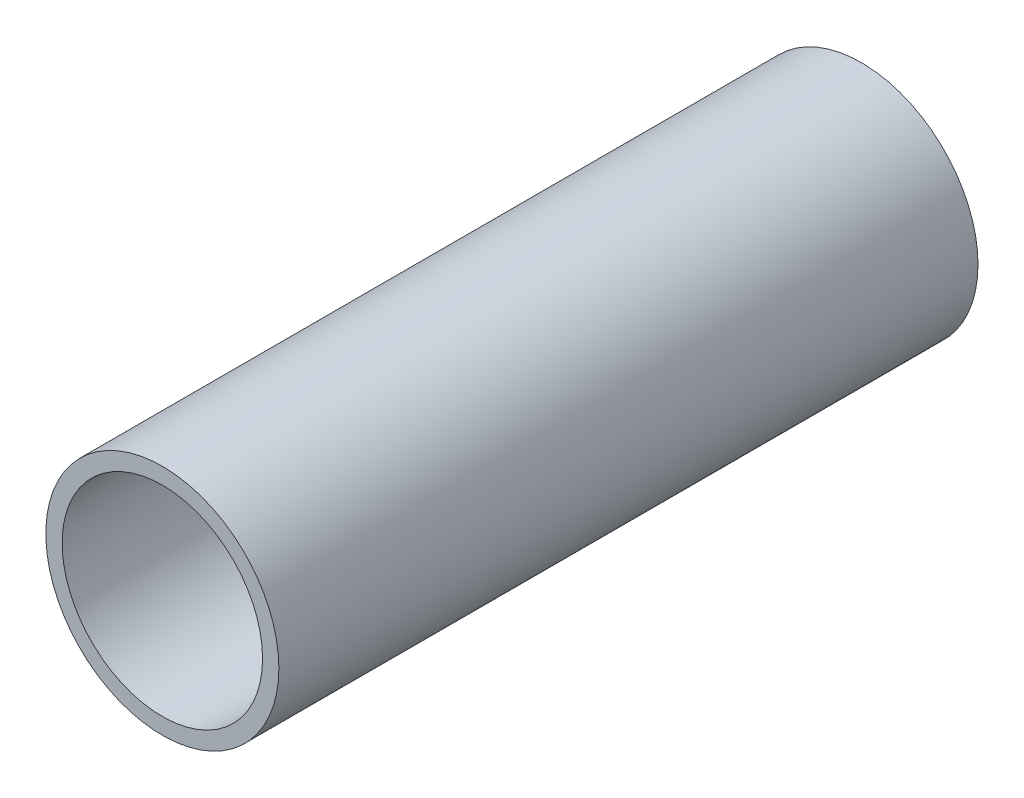
ISO-10303-21;
HEADER;
FILE_DESCRIPTION(('STEP AP214'),'2;1');
FILE_NAME('part.step','',(''),(''),'','','');
FILE_SCHEMA(('AUTOMOTIVE_DESIGN { 1 0 10303 214 1 1 1 1 }'));
ENDSEC;
DATA;
#1=APPLICATION_CONTEXT('core data for automotive mechanical design processes');
#2=APPLICATION_PROTOCOL_DEFINITION('international standard','automotive_design',2000,#1);
#3=PRODUCT_CONTEXT('',#1,'mechanical');
#4=PRODUCT('Part','Part','',(#3));
#5=PRODUCT_RELATED_PRODUCT_CATEGORY('part','',(#4));
#6=PRODUCT_DEFINITION_FORMATION('','',#4);
#7=PRODUCT_DEFINITION_CONTEXT('part definition',#1,'design');
#8=PRODUCT_DEFINITION('design','',#6,#7);
#9=PRODUCT_DEFINITION_SHAPE('','',#8);
#10=(LENGTH_UNIT() NAMED_UNIT(*) SI_UNIT(.MILLI.,.METRE.));
#11=(NAMED_UNIT(*) PLANE_ANGLE_UNIT() SI_UNIT($,.RADIAN.));
#12=(NAMED_UNIT(*) SI_UNIT($,.STERADIAN.) SOLID_ANGLE_UNIT());
#13=UNCERTAINTY_MEASURE_WITH_UNIT(LENGTH_MEASURE(1.E-05),#10,'distance_accuracy_value','');
#14=(GEOMETRIC_REPRESENTATION_CONTEXT(3) GLOBAL_UNCERTAINTY_ASSIGNED_CONTEXT((#13)) GLOBAL_UNIT_ASSIGNED_CONTEXT((#10,
#11,#12)) REPRESENTATION_CONTEXT('',''));
#15=CARTESIAN_POINT('',(0.,0.,0.));
#16=DIRECTION('',(0.,0.,1.));
#17=DIRECTION('',(1.,0.,0.));
#18=AXIS2_PLACEMENT_3D('',#15,#16,#17);
#19=CARTESIAN_POINT('',(0.,0.,38.1));
#20=DIRECTION('',(0.,0.,-1.));
#21=DIRECTION('',(-1.,0.,0.));
#22=AXIS2_PLACEMENT_3D('',#19,#20,#21);
#23=CYLINDRICAL_SURFACE('',#22,5.461);
#24=CARTESIAN_POINT('',(0.,-5.461,30.575));
#25=CARTESIAN_POINT('',(0.108491179154578,-5.46100223938956,30.5750030443358));
#26=CARTESIAN_POINT('',(0.216961048635089,-5.45773846887579,30.5661443732503));
#27=CARTESIAN_POINT('',(0.430668975561198,-5.44504371516819,30.5310793792461));
#28=CARTESIAN_POINT('',(0.535907330231654,-5.43561330095301,30.5048746567954));
#29=CARTESIAN_POINT('',(0.74003991624861,-5.41160028639268,30.4361619612842));
#30=CARTESIAN_POINT('',(0.838945632205151,-5.39702734411741,30.3936845369159));
#31=CARTESIAN_POINT('',(1.0282227072047,-5.36418849796975,30.2937838227913));
#32=CARTESIAN_POINT('',(1.11859188586085,-5.34592165432953,30.2363567286094));
#33=CARTESIAN_POINT('',(1.29191688691412,-5.30675604706477,30.1057370732668));
#34=CARTESIAN_POINT('',(1.37447791222339,-5.28578520274446,30.032042437963));
#35=CARTESIAN_POINT('',(1.5263838335753,-5.24393868438475,29.8720456387839));
#36=CARTESIAN_POINT('',(1.59572495122447,-5.22306303921336,29.7857398829259));
#37=CARTESIAN_POINT('',(1.72167571511299,-5.18294210411501,29.599180298446));
#38=CARTESIAN_POINT('',(1.77773750600785,-5.1637825010515,29.4985363414913));
#39=CARTESIAN_POINT('',(1.87196440094197,-5.13037895056659,29.2884352526025));
#40=CARTESIAN_POINT('',(1.91013627781836,-5.11613314340031,29.1789814743452));
#41=CARTESIAN_POINT('',(1.96595796341741,-5.09493820673969,28.9589023819991));
#42=CARTESIAN_POINT('',(1.98435850463217,-5.08772320236641,28.8484939329444));
#43=CARTESIAN_POINT('',(2.00246270555631,-5.08062674394286,28.6259388739682));
#44=CARTESIAN_POINT('',(2.00217363581966,-5.08074243813467,28.5137929569229));
#45=CARTESIAN_POINT('',(1.98348277458646,-5.08806422998194,28.2977077819827));
#46=CARTESIAN_POINT('',(1.96610816220022,-5.09486822011214,28.193663559153));
#47=CARTESIAN_POINT('',(1.91543258945748,-5.11413395542866,27.9900852341723));
#48=CARTESIAN_POINT('',(1.8821293426403,-5.12659651285562,27.8905517817617));
#49=CARTESIAN_POINT('',(1.7999547806136,-5.15602672826673,27.6966749352573));
#50=CARTESIAN_POINT('',(1.7508089263731,-5.17307288069246,27.6024603425425));
#51=CARTESIAN_POINT('',(1.638535328542,-5.20972199916762,27.4233114383435));
#52=CARTESIAN_POINT('',(1.57540291845724,-5.22932581766085,27.3383802383404));
#53=CARTESIAN_POINT('',(1.4321978565155,-5.27040948459133,27.1745034404436));
#54=CARTESIAN_POINT('',(1.35130081109236,-5.29192918644096,27.0962865357804));
#55=CARTESIAN_POINT('',(1.17728570725163,-5.33333947918591,26.9543183265342));
#56=CARTESIAN_POINT('',(1.08416594307532,-5.35322984206612,26.8905690443958));
#57=CARTESIAN_POINT('',(0.886559296206195,-5.38950386987367,26.778591347858));
#58=CARTESIAN_POINT('',(0.781930304371776,-5.40583397489143,26.7305951374218));
#59=CARTESIAN_POINT('',(0.565337186046532,-5.4327523874302,26.6531241613201));
#60=CARTESIAN_POINT('',(0.453376182832028,-5.44334312219322,26.6236415652072));
#61=CARTESIAN_POINT('',(0.231438010025861,-5.45716819459852,26.5854113358455));
#62=CARTESIAN_POINT('',(0.121651496236989,-5.46075057449371,26.5756817385615));
#63=CARTESIAN_POINT('',(-0.0980306351952367,-5.46122388338287,26.5743880048742));
#64=CARTESIAN_POINT('',(-0.207926225135362,-5.45811621526078,26.5828200600244));
#65=CARTESIAN_POINT('',(-0.420532609487839,-5.44578848874136,26.6168565685657));
#66=CARTESIAN_POINT('',(-0.523359409426412,-5.43679435894001,26.6418266824631));
#67=CARTESIAN_POINT('',(-0.723298895769758,-5.41382438256404,26.7074045701217));
#68=CARTESIAN_POINT('',(-0.820410836833405,-5.39984788785158,26.7480143784493));
#69=CARTESIAN_POINT('',(-1.00929827466281,-5.36780071334321,26.844996189869));
#70=CARTESIAN_POINT('',(-1.10083913633824,-5.34962359428052,26.901788948068));
#71=CARTESIAN_POINT('',(-1.27339154965867,-5.31119779335956,27.0290452196877));
#72=CARTESIAN_POINT('',(-1.35439932867276,-5.29094837388133,27.0995136089035));
#73=CARTESIAN_POINT('',(-1.50826525829655,-5.24922498579124,27.2567100740174));
#74=CARTESIAN_POINT('',(-1.58042534033367,-5.2277452042933,27.3441216461276));
#75=CARTESIAN_POINT('',(-1.70917944910057,-5.18708001418718,27.5302465011366));
#76=CARTESIAN_POINT('',(-1.76577241023928,-5.16789476269355,27.6289605570514));
#77=CARTESIAN_POINT('',(-1.86175863758426,-5.13410031540785,27.8355073177876));
#78=CARTESIAN_POINT('',(-1.90110769778134,-5.11950290764174,27.9433626228273));
#79=CARTESIAN_POINT('',(-1.96084433341598,-5.09692555269108,28.1648473177861));
#80=CARTESIAN_POINT('',(-1.98124290720843,-5.08894176742893,28.2784733181089));
#81=CARTESIAN_POINT('',(-2.00154177740892,-5.08098995122837,28.5007497087811));
#82=CARTESIAN_POINT('',(-2.00262533523918,-5.08055923805152,28.6092764523232));
#83=CARTESIAN_POINT('',(-1.98726894814168,-5.08658527787233,28.8248777450848));
#84=CARTESIAN_POINT('',(-1.97083051117601,-5.09304143817814,28.9319524184679));
#85=CARTESIAN_POINT('',(-1.92180124615361,-5.11173702032731,29.1386052574135));
#86=CARTESIAN_POINT('',(-1.88967130752248,-5.12381098431463,29.2383089970548));
#87=CARTESIAN_POINT('',(-1.81056913492781,-5.15229258994758,29.4309739493755));
#88=CARTESIAN_POINT('',(-1.7635932346924,-5.16870130191279,29.5239334895669));
#89=CARTESIAN_POINT('',(-1.65336920167476,-5.20503760461863,29.7055845457592));
#90=CARTESIAN_POINT('',(-1.58941765168616,-5.22510128962595,29.793821712823));
#91=CARTESIAN_POINT('',(-1.44816795133776,-5.26599768525611,29.9586912474642));
#92=CARTESIAN_POINT('',(-1.37086566048682,-5.28683063287132,30.0353200010211));
#93=CARTESIAN_POINT('',(-1.20042483162023,-5.32818545097307,30.178745068204));
#94=CARTESIAN_POINT('',(-1.1066825755437,-5.34863814271819,30.2448469480443));
#95=CARTESIAN_POINT('',(-0.908707931475497,-5.38580572290981,30.3603232509934));
#96=CARTESIAN_POINT('',(-0.804475539815672,-5.40252061004928,30.4096976682529));
#97=CARTESIAN_POINT('',(-0.585788005534008,-5.43063484324844,30.4909255295511));
#98=CARTESIAN_POINT('',(-0.471148400865916,-5.44189797665209,30.5223332433169));
#99=CARTESIAN_POINT('',(-0.237662750728607,-5.45707769895462,30.564364200503));
#100=CARTESIAN_POINT('',(-0.118818595484139,-5.46099754744003,30.57499666587));
#101=CARTESIAN_POINT('',(0.,-5.461,30.575));
#102=B_SPLINE_CURVE_WITH_KNOTS('',3,(#24,#25,#26,#27,#28,#29,#30,#31,#32,#33,#34,#35,#36,#37,
#38,#39,#40,#41,#42,#43,#44,#45,#46,#47,#48,#49,#50,#51,#52,#53,#54,#55,#56,#57,#58,#59,#60,#61,
#62,#63,#64,#65,#66,#67,#68,#69,#70,#71,#72,#73,#74,#75,#76,#77,#78,#79,#80,#81,#82,#83,#84,#85,
#86,#87,#88,#89,#90,#91,#92,#93,#94,#95,#96,#97,#98,#99,#100,#101),.UNSPECIFIED.,.T.,.F.,(4,2,2,
2,2,2,2,2,2,2,2,2,2,2,2,2,2,2,2,2,2,2,2,2,2,2,2,2,2,2,2,2,2,2,2,2,2,2,4),(0.,0.325035485459794,
0.650040985051903,0.974439319269884,1.2989202879437,1.63533301902956,1.97184175686376,
2.32045828299172,2.66894272161796,3.00366862406861,3.3382643136382,3.6539021013308,
3.96958521055328,4.29106284169025,4.61264789303976,4.95477117656569,5.29694225645355,
5.64395149492557,5.99081386466917,6.31996345341913,6.64904402716554,6.96618137042539,
7.28335998399854,7.60968485742597,7.93612629044886,8.28061354314366,8.62512437060534,
8.97051328287646,9.31570161521287,9.63966528093859,9.96360106824688,10.2785476004609,
10.5935719708855,10.9245452578261,11.2556213750811,11.6034634036284,11.951305553808,
12.3074397102256,12.6634157459346),.UNSPECIFIED.);
#103=CARTESIAN_POINT('',(0.,-5.461,30.575));
#104=VERTEX_POINT('',#103);
#105=EDGE_CURVE('E68',#104,#104,#102,.T.);
#106=ORIENTED_EDGE('',*,*,#105,.F.);
#107=EDGE_LOOP('',(#106));
#108=FACE_BOUND('',#107,.T.);
#109=CARTESIAN_POINT('',(0.,-5.461,11.525));
#110=CARTESIAN_POINT('',(0.108491179154579,-5.46100223938956,11.5250030443358));
#111=CARTESIAN_POINT('',(0.21696104863509,-5.45773846887579,11.5161443732503));
#112=CARTESIAN_POINT('',(0.430668975561199,-5.44504371516819,11.4810793792461));
#113=CARTESIAN_POINT('',(0.535907330231654,-5.43561330095301,11.4548746567954));
#114=CARTESIAN_POINT('',(0.740039916248611,-5.41160028639268,11.3861619612842));
#115=CARTESIAN_POINT('',(0.838945632205152,-5.39702734411741,11.3436845369159));
#116=CARTESIAN_POINT('',(1.0282227072047,-5.36418849796975,11.2437838227913));
#117=CARTESIAN_POINT('',(1.11859188586085,-5.34592165432953,11.1863567286094));
#118=CARTESIAN_POINT('',(1.29191688691412,-5.30675604706476,11.0557370732668));
#119=CARTESIAN_POINT('',(1.37447791222339,-5.28578520274446,10.982042437963));
#120=CARTESIAN_POINT('',(1.5263838335753,-5.24393868438475,10.8220456387839));
#121=CARTESIAN_POINT('',(1.59572495122447,-5.22306303921336,10.7357398829259));
#122=CARTESIAN_POINT('',(1.72167571511299,-5.18294210411501,10.549180298446));
#123=CARTESIAN_POINT('',(1.77773750600785,-5.1637825010515,10.4485363414913));
#124=CARTESIAN_POINT('',(1.87196440094197,-5.13037895056659,10.2384352526025));
#125=CARTESIAN_POINT('',(1.91013627781836,-5.11613314340031,10.1289814743452));
#126=CARTESIAN_POINT('',(1.96595796341741,-5.09493820673969,9.9089023819991));
#127=CARTESIAN_POINT('',(1.98435850463217,-5.08772320236641,9.7984939329444));
#128=CARTESIAN_POINT('',(2.00246270555631,-5.08062674394286,9.57593887396818));
#129=CARTESIAN_POINT('',(2.00217363581966,-5.08074243813467,9.4637929569229));
#130=CARTESIAN_POINT('',(1.98348277458646,-5.08806422998194,9.24770778198275));
#131=CARTESIAN_POINT('',(1.96610816220023,-5.09486822011214,9.14366355915301));
#132=CARTESIAN_POINT('',(1.91543258945748,-5.11413395542866,8.94008523417226));
#133=CARTESIAN_POINT('',(1.8821293426403,-5.12659651285562,8.84055178176172));
#134=CARTESIAN_POINT('',(1.7999547806136,-5.15602672826673,8.64667493525727));
#135=CARTESIAN_POINT('',(1.7508089263731,-5.17307288069246,8.55246034254245));
#136=CARTESIAN_POINT('',(1.638535328542,-5.20972199916762,8.37331143834355));
#137=CARTESIAN_POINT('',(1.57540291845724,-5.22932581766085,8.28838023834038));
#138=CARTESIAN_POINT('',(1.4321978565155,-5.27040948459133,8.12450344044362));
#139=CARTESIAN_POINT('',(1.35130081109235,-5.29192918644096,8.04628653578038));
#140=CARTESIAN_POINT('',(1.17728570725163,-5.33333947918591,7.90431832653424));
#141=CARTESIAN_POINT('',(1.08416594307532,-5.35322984206612,7.8405690443958));
#142=CARTESIAN_POINT('',(0.886559296206197,-5.38950386987367,7.728591347858));
#143=CARTESIAN_POINT('',(0.781930304371777,-5.40583397489143,7.68059513742183));
#144=CARTESIAN_POINT('',(0.565337186046533,-5.4327523874302,7.60312416132009));
#145=CARTESIAN_POINT('',(0.453376182832029,-5.44334312219322,7.57364156520723));
#146=CARTESIAN_POINT('',(0.231438010025862,-5.45716819459852,7.53541133584546));
#147=CARTESIAN_POINT('',(0.12165149623699,-5.46075057449371,7.52568173856152));
#148=CARTESIAN_POINT('',(-0.0980306351952351,-5.46122388338287,7.52438800487416));
#149=CARTESIAN_POINT('',(-0.207926225135361,-5.45811621526078,7.53282006002439));
#150=CARTESIAN_POINT('',(-0.420532609487837,-5.44578848874136,7.56685656856565));
#151=CARTESIAN_POINT('',(-0.52335940942641,-5.43679435894001,7.59182668246314));
#152=CARTESIAN_POINT('',(-0.723298895769756,-5.41382438256404,7.6574045701217));
#153=CARTESIAN_POINT('',(-0.820410836833404,-5.39984788785158,7.69801437844927));
#154=CARTESIAN_POINT('',(-1.00929827466281,-5.36780071334321,7.79499618986903));
#155=CARTESIAN_POINT('',(-1.10083913633824,-5.34962359428052,7.85178894806802));
#156=CARTESIAN_POINT('',(-1.27339154965867,-5.31119779335956,7.97904521968775));
#157=CARTESIAN_POINT('',(-1.35439932867276,-5.29094837388134,8.04951360890352));
#158=CARTESIAN_POINT('',(-1.50826525829655,-5.24922498579124,8.20671007401743));
#159=CARTESIAN_POINT('',(-1.58042534033367,-5.2277452042933,8.29412164612759));
#160=CARTESIAN_POINT('',(-1.70917944910057,-5.18708001418718,8.48024650113656));
#161=CARTESIAN_POINT('',(-1.76577241023928,-5.16789476269355,8.57896055705142));
#162=CARTESIAN_POINT('',(-1.86175863758426,-5.13410031540785,8.78550731778756));
#163=CARTESIAN_POINT('',(-1.90110769778134,-5.11950290764174,8.89336262282728));
#164=CARTESIAN_POINT('',(-1.96084433341598,-5.09692555269108,9.11484731778612));
#165=CARTESIAN_POINT('',(-1.98124290720843,-5.08894176742893,9.22847331810889));
#166=CARTESIAN_POINT('',(-2.00154177740892,-5.08098995122837,9.45074970878109));
#167=CARTESIAN_POINT('',(-2.00262533523918,-5.08055923805152,9.5592764523232));
#168=CARTESIAN_POINT('',(-1.98726894814168,-5.08658527787233,9.77487774508479));
#169=CARTESIAN_POINT('',(-1.97083051117601,-5.09304143817814,9.88195241846794));
#170=CARTESIAN_POINT('',(-1.92180124615361,-5.11173702032731,10.0886052574135));
#171=CARTESIAN_POINT('',(-1.88967130752248,-5.12381098431463,10.1883089970548));
#172=CARTESIAN_POINT('',(-1.8105691349278,-5.15229258994758,10.3809739493755));
#173=CARTESIAN_POINT('',(-1.76359323469239,-5.16870130191279,10.4739334895669));
#174=CARTESIAN_POINT('',(-1.65336920167476,-5.20503760461863,10.6555845457592));
#175=CARTESIAN_POINT('',(-1.58941765168616,-5.22510128962595,10.743821712823));
#176=CARTESIAN_POINT('',(-1.44816795133775,-5.26599768525612,10.9086912474642));
#177=CARTESIAN_POINT('',(-1.37086566048682,-5.28683063287132,10.9853200010211));
#178=CARTESIAN_POINT('',(-1.20042483162023,-5.32818545097307,11.128745068204));
#179=CARTESIAN_POINT('',(-1.1066825755437,-5.34863814271819,11.1948469480443));
#180=CARTESIAN_POINT('',(-0.908707931475494,-5.38580572290981,11.3103232509934));
#181=CARTESIAN_POINT('',(-0.804475539815669,-5.40252061004928,11.3596976682529));
#182=CARTESIAN_POINT('',(-0.585788005534006,-5.43063484324845,11.4409255295511));
#183=CARTESIAN_POINT('',(-0.471148400865914,-5.44189797665209,11.4723332433169));
#184=CARTESIAN_POINT('',(-0.237662750728605,-5.45707769895462,11.514364200503));
#185=CARTESIAN_POINT('',(-0.118818595484137,-5.46099754744003,11.52499666587));
#186=CARTESIAN_POINT('',(0.,-5.461,11.525));
#187=B_SPLINE_CURVE_WITH_KNOTS('',3,(#109,#110,#111,#112,#113,#114,#115,#116,#117,#118,#119,
#120,#121,#122,#123,#124,#125,#126,#127,#128,#129,#130,#131,#132,#133,#134,#135,#136,#137,#138,
#139,#140,#141,#142,#143,#144,#145,#146,#147,#148,#149,#150,#151,#152,#153,#154,#155,#156,#157,
#158,#159,#160,#161,#162,#163,#164,#165,#166,#167,#168,#169,#170,#171,#172,#173,#174,#175,#176,
#177,#178,#179,#180,#181,#182,#183,#184,#185,#186),.UNSPECIFIED.,.T.,.F.,(4,2,2,2,2,2,2,2,2,2,2,
2,2,2,2,2,2,2,2,2,2,2,2,2,2,2,2,2,2,2,2,2,2,2,2,2,2,2,4),(0.,0.325035485459794,
0.650040985051903,0.974439319269884,1.2989202879437,1.63533301902956,1.97184175686376,
2.32045828299172,2.66894272161796,3.00366862406862,3.3382643136382,3.6539021013308,
3.96958521055327,4.29106284169025,4.61264789303976,4.95477117656569,5.29694225645355,
5.64395149492557,5.99081386466917,6.31996345341912,6.64904402716554,6.96618137042539,
7.28335998399854,7.60968485742597,7.93612629044886,8.28061354314366,8.62512437060534,
8.97051328287646,9.31570161521287,9.63966528093859,9.96360106824688,10.2785476004609,
10.5935719708855,10.9245452578261,11.2556213750811,11.6034634036284,11.951305553808,
12.3074397102256,12.6634157459346),.UNSPECIFIED.);
#188=CARTESIAN_POINT('',(0.,-5.461,11.525));
#189=VERTEX_POINT('',#188);
#190=EDGE_CURVE('E60',#189,#189,#187,.T.);
#191=ORIENTED_EDGE('',*,*,#190,.F.);
#192=EDGE_LOOP('',(#191));
#193=FACE_BOUND('',#192,.T.);
#194=CARTESIAN_POINT('',(0.,0.,38.1));
#195=DIRECTION('',(0.,0.,1.));
#196=DIRECTION('',(1.,0.,0.));
#197=AXIS2_PLACEMENT_3D('',#194,#195,#196);
#198=CIRCLE('',#197,5.461);
#199=CARTESIAN_POINT('',(5.461,0.,38.1));
#200=VERTEX_POINT('',#199);
#201=EDGE_CURVE('E48',#200,#200,#198,.T.);
#202=ORIENTED_EDGE('',*,*,#201,.T.);
#203=EDGE_LOOP('',(#202));
#204=FACE_BOUND('',#203,.T.);
#205=CARTESIAN_POINT('',(0.,0.,0.));
#206=DIRECTION('',(0.,0.,1.));
#207=DIRECTION('',(1.,0.,0.));
#208=AXIS2_PLACEMENT_3D('',#205,#206,#207);
#209=CIRCLE('',#208,5.461);
#210=CARTESIAN_POINT('',(5.461,0.,0.));
#211=VERTEX_POINT('',#210);
#212=EDGE_CURVE('E57',#211,#211,#209,.T.);
#213=ORIENTED_EDGE('',*,*,#212,.F.);
#214=EDGE_LOOP('',(#213));
#215=FACE_BOUND('',#214,.T.);
#216=ADVANCED_FACE('F36',(#108,#193,#204,#215),#23,.F.);
#217=CARTESIAN_POINT('',(0.,0.,38.1));
#218=DIRECTION('',(0.,0.,-1.));
#219=DIRECTION('',(-1.,0.,0.));
#220=AXIS2_PLACEMENT_3D('',#217,#218,#219);
#221=CYLINDRICAL_SURFACE('',#220,6.35);
#222=CARTESIAN_POINT('',(0.,-6.35,30.575));
#223=CARTESIAN_POINT('',(0.109459382542907,-6.34999954177387,30.5749994164505));
#224=CARTESIAN_POINT('',(0.218925049959982,-6.34714311321166,30.5659844128984));
#225=CARTESIAN_POINT('',(0.434652473788956,-6.33602827356407,30.5302589175087));
#226=CARTESIAN_POINT('',(0.540913545874182,-6.32776871709148,30.5035446736654));
#227=CARTESIAN_POINT('',(0.747089875657803,-6.30674936557198,30.433412839271));
#228=CARTESIAN_POINT('',(0.847014764673544,-6.2939966038065,30.3900213442808));
#229=CARTESIAN_POINT('',(1.03817017833074,-6.26530583445687,30.287878559723));
#230=CARTESIAN_POINT('',(1.12939928812193,-6.24936730983396,30.2291247764294));
#231=CARTESIAN_POINT('',(1.30343118018697,-6.21543683798116,30.0959886387944));
#232=CARTESIAN_POINT('',(1.38592345094522,-6.19739963027479,30.0212119736439));
#233=CARTESIAN_POINT('',(1.53742831833673,-6.16156531174633,29.858992127567));
#234=CARTESIAN_POINT('',(1.60643835501439,-6.14376824711775,29.7715465465938));
#235=CARTESIAN_POINT('',(1.73071363408787,-6.10994220236163,29.5837707062383));
#236=CARTESIAN_POINT('',(1.78558916761595,-6.09396900491067,29.4831715227718));
#237=CARTESIAN_POINT('',(1.87751386092633,-6.06628083683232,29.273588013396));
#238=CARTESIAN_POINT('',(1.91456780104787,-6.05456472452069,29.1646059451607));
#239=CARTESIAN_POINT('',(1.96865797245166,-6.03719105635796,28.9448574324552));
#240=CARTESIAN_POINT('',(1.98627089440143,-6.03135942687503,28.8342470865849));
#241=CARTESIAN_POINT('',(2.00278087222624,-6.02589838737814,28.611499438398));
#242=CARTESIAN_POINT('',(2.00168299423813,-6.02626729850521,28.4993625576223));
#243=CARTESIAN_POINT('',(1.98125320609646,-6.03301213155008,28.281532037457));
#244=CARTESIAN_POINT('',(1.96265658538293,-6.03914580837347,28.1757606687388));
#245=CARTESIAN_POINT('',(1.90895021373769,-6.05633519979143,27.9689230657145));
#246=CARTESIAN_POINT('',(1.8738386824976,-6.06739144503234,27.8678573399681));
#247=CARTESIAN_POINT('',(1.78758434079555,-6.0933643515369,27.6715576691876));
#248=CARTESIAN_POINT('',(1.73621215869283,-6.10833567795451,27.5764320539873));
#249=CARTESIAN_POINT('',(1.6190540664784,-6.14042705773518,27.3959112784986));
#250=CARTESIAN_POINT('',(1.55326436261561,-6.15754767614423,27.3105186883145));
#251=CARTESIAN_POINT('',(1.40553948054554,-6.19297824394465,27.1477338767739));
#252=CARTESIAN_POINT('',(1.32299795804768,-6.2113065642987,27.0708948770763));
#253=CARTESIAN_POINT('',(1.14597287727255,-6.24638917019528,26.9320139239921));
#254=CARTESIAN_POINT('',(1.05148840693984,-6.26314333535266,26.8699731017542));
#255=CARTESIAN_POINT('',(0.852181054275976,-6.29337063173254,26.7620667906204));
#256=CARTESIAN_POINT('',(0.747281283701516,-6.30681635072294,26.7163351185409));
#257=CARTESIAN_POINT('',(0.530755398571081,-6.32871380255594,26.6433321461039));
#258=CARTESIAN_POINT('',(0.41913137167114,-6.33716707666897,26.6160551480299));
#259=CARTESIAN_POINT('',(0.197020017835358,-6.34787832908592,26.5816825321787));
#260=CARTESIAN_POINT('',(0.0866594761204077,-6.35036604099747,26.5738381508384));
#261=CARTESIAN_POINT('',(-0.133813926362038,-6.34954641773507,26.5764398014465));
#262=CARTESIAN_POINT('',(-0.243926821510503,-6.34623994398884,26.5868831145439));
#263=CARTESIAN_POINT('',(-0.457878637788791,-6.33435451969435,26.6251635385388));
#264=CARTESIAN_POINT('',(-0.561805824109794,-6.325911202165,26.6525534967289));
#265=CARTESIAN_POINT('',(-0.763559126456238,-6.30474229444981,26.7234025516334));
#266=CARTESIAN_POINT('',(-0.861384483733321,-6.29201617296049,26.7668636421191));
#267=CARTESIAN_POINT('',(-1.05083641206033,-6.26319856305455,26.8698162477041));
#268=CARTESIAN_POINT('',(-1.14225110153446,-6.24703194034033,26.9296760518015));
#269=CARTESIAN_POINT('',(-1.31398832981217,-6.21318025142311,27.0632861183055));
#270=CARTESIAN_POINT('',(-1.394307804701,-6.19549476796846,27.137040204344));
#271=CARTESIAN_POINT('',(-1.54493496266177,-6.15970098041184,27.2998673031687));
#272=CARTESIAN_POINT('',(-1.61470885314466,-6.1416043516294,27.3894378122509));
#273=CARTESIAN_POINT('',(-1.73828550034023,-6.10778048462924,27.5794090831817));
#274=CARTESIAN_POINT('',(-1.79208847266324,-6.09205321442616,27.679809698797));
#275=CARTESIAN_POINT('',(-1.88186972548412,-6.06492137157673,27.888409224334));
#276=CARTESIAN_POINT('',(-1.91791378151849,-6.05350088491069,27.9965776311165));
#277=CARTESIAN_POINT('',(-1.97114343438128,-6.03638058511951,28.2178829630451));
#278=CARTESIAN_POINT('',(-1.98833635449891,-6.03067855056365,28.3310179410006));
#279=CARTESIAN_POINT('',(-2.00284439370545,-6.02587471885277,28.553457549833));
#280=CARTESIAN_POINT('',(-2.00103634345504,-6.02648176413455,28.6626994025011));
#281=CARTESIAN_POINT('',(-1.97971522185172,-6.03351893966243,28.8792406125789));
#282=CARTESIAN_POINT('',(-1.96020300106662,-6.03994879016139,28.9865400630555));
#283=CARTESIAN_POINT('',(-1.90461841343822,-6.05770205715241,29.1945554397263));
#284=CARTESIAN_POINT('',(-1.86880073990097,-6.06895005951139,29.2953463480582));
#285=CARTESIAN_POINT('',(-1.78182311987174,-6.0950519726527,29.4895681563782));
#286=CARTESIAN_POINT('',(-1.7306600173762,-6.10990662507357,29.5829975373686));
#287=CARTESIAN_POINT('',(-1.61207166769779,-6.14228296482453,29.763855335519));
#288=CARTESIAN_POINT('',(-1.54408200610561,-6.15988705347009,29.850898871557));
#289=CARTESIAN_POINT('',(-1.39475914789555,-6.19540382399595,30.0126251607499));
#290=CARTESIAN_POINT('',(-1.31342235965995,-6.21331658777418,30.0873045759105));
#291=CARTESIAN_POINT('',(-1.13645022907771,-6.24814930497826,30.2246785891825));
#292=CARTESIAN_POINT('',(-1.04042842012035,-6.26501620684602,30.2868902911795));
#293=CARTESIAN_POINT('',(-0.838759092324702,-6.29518499838427,30.3942078809382));
#294=CARTESIAN_POINT('',(-0.733115228456041,-6.30848823421976,30.4393202306128));
#295=CARTESIAN_POINT('',(-0.523924084589957,-6.32915110555605,30.5080388110267));
#296=CARTESIAN_POINT('',(-0.420884380962412,-6.33690087757196,30.5330760227662));
#297=CARTESIAN_POINT('',(-0.211898004201454,-6.34732501355995,30.5665551568794));
#298=CARTESIAN_POINT('',(-0.105951946376476,-6.35000044354306,30.5750005648507));
#299=CARTESIAN_POINT('',(0.,-6.35,30.575));
#300=B_SPLINE_CURVE_WITH_KNOTS('',3,(#222,#223,#224,#225,#226,#227,#228,#229,#230,#231,#232,
#233,#234,#235,#236,#237,#238,#239,#240,#241,#242,#243,#244,#245,#246,#247,#248,#249,#250,#251,
#252,#253,#254,#255,#256,#257,#258,#259,#260,#261,#262,#263,#264,#265,#266,#267,#268,#269,#270,
#271,#272,#273,#274,#275,#276,#277,#278,#279,#280,#281,#282,#283,#284,#285,#286,#287,#288,#289,
#290,#291,#292,#293,#294,#295,#296,#297,#298,#299),.UNSPECIFIED.,.T.,.F.,(4,2,2,2,2,2,2,2,2,2,2,
2,2,2,2,2,2,2,2,2,2,2,2,2,2,2,2,2,2,2,2,2,2,2,2,2,2,2,4),(0.,0.327988650558007,
0.656046852642942,0.983593805173076,1.31119396071542,1.6480406473964,1.98495123122211,
2.33034249119075,2.67564105409013,3.01039595432063,3.34506021774285,3.66626171481526,
3.98749784536771,4.31348397544876,4.63955598702786,4.9807199943601,5.32191007136131,
5.66583848283943,6.00966066096294,6.34001323425943,6.67031669785623,6.99225602053112,
7.31423529613717,7.64414085870835,7.97413734250024,8.31743010871831,8.6607182402099,
9.00272515843012,9.34459916667784,9.67076879349641,9.99692275086076,10.3181482438305,
10.6394398466999,10.9734721104888,11.3075944078494,11.6528624869261,11.9979999574323,
12.3155454971876,12.6330243200048),.UNSPECIFIED.);
#301=CARTESIAN_POINT('',(0.,-6.35,30.575));
#302=VERTEX_POINT('',#301);
#303=EDGE_CURVE('E40',#302,#302,#300,.T.);
#304=ORIENTED_EDGE('',*,*,#303,.T.);
#305=EDGE_LOOP('',(#304));
#306=FACE_BOUND('',#305,.T.);
#307=CARTESIAN_POINT('',(0.,-6.35,11.525));
#308=CARTESIAN_POINT('',(0.109459382542908,-6.34999954177387,11.5249994164505));
#309=CARTESIAN_POINT('',(0.218925049959983,-6.34714311321166,11.5159844128984));
#310=CARTESIAN_POINT('',(0.434652473788956,-6.33602827356407,11.4802589175087));
#311=CARTESIAN_POINT('',(0.540913545874183,-6.32776871709148,11.4535446736654));
#312=CARTESIAN_POINT('',(0.747089875657804,-6.30674936557198,11.383412839271));
#313=CARTESIAN_POINT('',(0.847014764673545,-6.2939966038065,11.3400213442808));
#314=CARTESIAN_POINT('',(1.03817017833074,-6.26530583445687,11.237878559723));
#315=CARTESIAN_POINT('',(1.12939928812193,-6.24936730983396,11.1791247764294));
#316=CARTESIAN_POINT('',(1.30343118018697,-6.21543683798116,11.0459886387944));
#317=CARTESIAN_POINT('',(1.38592345094522,-6.19739963027479,10.9712119736439));
#318=CARTESIAN_POINT('',(1.53742831833673,-6.16156531174633,10.808992127567));
#319=CARTESIAN_POINT('',(1.60643835501439,-6.14376824711775,10.7215465465937));
#320=CARTESIAN_POINT('',(1.73071363408787,-6.10994220236164,10.5337707062383));
#321=CARTESIAN_POINT('',(1.78558916761595,-6.09396900491067,10.4331715227718));
#322=CARTESIAN_POINT('',(1.87751386092633,-6.06628083683232,10.223588013396));
#323=CARTESIAN_POINT('',(1.91456780104787,-6.05456472452069,10.1146059451607));
#324=CARTESIAN_POINT('',(1.96865797245166,-6.03719105635796,9.89485743245523));
#325=CARTESIAN_POINT('',(1.98627089440143,-6.03135942687503,9.78424708658491));
#326=CARTESIAN_POINT('',(2.00278087222624,-6.02589838737814,9.56149943839799));
#327=CARTESIAN_POINT('',(2.00168299423813,-6.02626729850521,9.4493625576223));
#328=CARTESIAN_POINT('',(1.98125320609646,-6.03301213155008,9.23153203745703));
#329=CARTESIAN_POINT('',(1.96265658538293,-6.03914580837347,9.12576066873881));
#330=CARTESIAN_POINT('',(1.90895021373769,-6.05633519979143,8.91892306571445));
#331=CARTESIAN_POINT('',(1.8738386824976,-6.06739144503234,8.8178573399681));
#332=CARTESIAN_POINT('',(1.78758434079555,-6.0933643515369,8.62155766918764));
#333=CARTESIAN_POINT('',(1.73621215869284,-6.10833567795451,8.52643205398725));
#334=CARTESIAN_POINT('',(1.6190540664784,-6.14042705773518,8.34591127849859));
#335=CARTESIAN_POINT('',(1.55326436261562,-6.15754767614423,8.26051868831451));
#336=CARTESIAN_POINT('',(1.40553948054554,-6.19297824394465,8.09773387677394));
#337=CARTESIAN_POINT('',(1.32299795804768,-6.2113065642987,8.0208948770763));
#338=CARTESIAN_POINT('',(1.14597287727256,-6.24638917019528,7.88201392399215));
#339=CARTESIAN_POINT('',(1.05148840693985,-6.26314333535266,7.81997310175418));
#340=CARTESIAN_POINT('',(0.852181054275979,-6.29337063173253,7.71206679062044));
#341=CARTESIAN_POINT('',(0.747281283701517,-6.30681635072294,7.66633511854089));
#342=CARTESIAN_POINT('',(0.530755398571081,-6.32871380255594,7.59333214610388));
#343=CARTESIAN_POINT('',(0.41913137167114,-6.33716707666897,7.5660551480299));
#344=CARTESIAN_POINT('',(0.197020017835358,-6.34787832908592,7.53168253217873));
#345=CARTESIAN_POINT('',(0.0866594761204083,-6.35036604099747,7.5238381508384));
#346=CARTESIAN_POINT('',(-0.133813926362036,-6.34954641773507,7.52643980144652));
#347=CARTESIAN_POINT('',(-0.243926821510502,-6.34623994398884,7.53688311454394));
#348=CARTESIAN_POINT('',(-0.45787863778879,-6.33435451969435,7.57516353853882));
#349=CARTESIAN_POINT('',(-0.561805824109793,-6.325911202165,7.60255349672888));
#350=CARTESIAN_POINT('',(-0.763559126456237,-6.30474229444981,7.67340255163337));
#351=CARTESIAN_POINT('',(-0.86138448373332,-6.29201617296049,7.71686364211909));
#352=CARTESIAN_POINT('',(-1.05083641206033,-6.26319856305455,7.81981624770413));
#353=CARTESIAN_POINT('',(-1.14225110153446,-6.24703194034033,7.87967605180154));
#354=CARTESIAN_POINT('',(-1.31398832981217,-6.21318025142311,8.01328611830548));
#355=CARTESIAN_POINT('',(-1.394307804701,-6.19549476796846,8.08704020434404));
#356=CARTESIAN_POINT('',(-1.54493496266177,-6.15970098041184,8.24986730316873));
#357=CARTESIAN_POINT('',(-1.61470885314466,-6.1416043516294,8.33943781225089));
#358=CARTESIAN_POINT('',(-1.73828550034023,-6.10778048462924,8.52940908318169));
#359=CARTESIAN_POINT('',(-1.79208847266324,-6.09205321442616,8.62980969879696));
#360=CARTESIAN_POINT('',(-1.88186972548412,-6.06492137157673,8.83840922433402));
#361=CARTESIAN_POINT('',(-1.91791378151849,-6.05350088491069,8.94657763111647));
#362=CARTESIAN_POINT('',(-1.97114343438127,-6.03638058511952,9.16788296304509));
#363=CARTESIAN_POINT('',(-1.98833635449891,-6.03067855056365,9.28101794100063));
#364=CARTESIAN_POINT('',(-2.00284439370545,-6.02587471885277,9.50345754983298));
#365=CARTESIAN_POINT('',(-2.00103634345503,-6.02648176413455,9.61269940250111));
#366=CARTESIAN_POINT('',(-1.97971522185172,-6.03351893966243,9.82924061257888));
#367=CARTESIAN_POINT('',(-1.96020300106662,-6.03994879016139,9.93654006305545));
#368=CARTESIAN_POINT('',(-1.90461841343822,-6.05770205715241,10.1445554397263));
#369=CARTESIAN_POINT('',(-1.86880073990096,-6.06895005951139,10.2453463480582));
#370=CARTESIAN_POINT('',(-1.78182311987174,-6.0950519726527,10.4395681563782));
#371=CARTESIAN_POINT('',(-1.7306600173762,-6.10990662507357,10.5329975373686));
#372=CARTESIAN_POINT('',(-1.61207166769779,-6.14228296482453,10.713855335519));
#373=CARTESIAN_POINT('',(-1.54408200610561,-6.15988705347009,10.800898871557));
#374=CARTESIAN_POINT('',(-1.39475914789555,-6.19540382399596,10.9626251607499));
#375=CARTESIAN_POINT('',(-1.31342235965995,-6.21331658777418,11.0373045759105));
#376=CARTESIAN_POINT('',(-1.1364502290777,-6.24814930497826,11.1746785891825));
#377=CARTESIAN_POINT('',(-1.04042842012034,-6.26501620684602,11.2368902911795));
#378=CARTESIAN_POINT('',(-0.8387590923247,-6.29518499838427,11.3442078809382));
#379=CARTESIAN_POINT('',(-0.733115228456039,-6.30848823421976,11.3893202306128));
#380=CARTESIAN_POINT('',(-0.523924084589955,-6.32915110555605,11.4580388110267));
#381=CARTESIAN_POINT('',(-0.420884380962411,-6.33690087757196,11.4830760227662));
#382=CARTESIAN_POINT('',(-0.211898004201452,-6.34732501355995,11.5165551568794));
#383=CARTESIAN_POINT('',(-0.105951946376474,-6.35000044354306,11.5250005648507));
#384=CARTESIAN_POINT('',(0.,-6.35,11.525));
#385=B_SPLINE_CURVE_WITH_KNOTS('',3,(#307,#308,#309,#310,#311,#312,#313,#314,#315,#316,#317,
#318,#319,#320,#321,#322,#323,#324,#325,#326,#327,#328,#329,#330,#331,#332,#333,#334,#335,#336,
#337,#338,#339,#340,#341,#342,#343,#344,#345,#346,#347,#348,#349,#350,#351,#352,#353,#354,#355,
#356,#357,#358,#359,#360,#361,#362,#363,#364,#365,#366,#367,#368,#369,#370,#371,#372,#373,#374,
#375,#376,#377,#378,#379,#380,#381,#382,#383,#384),.UNSPECIFIED.,.T.,.F.,(4,2,2,2,2,2,2,2,2,2,2,
2,2,2,2,2,2,2,2,2,2,2,2,2,2,2,2,2,2,2,2,2,2,2,2,2,2,2,4),(0.,0.327988650558007,
0.656046852642941,0.983593805173076,1.31119396071542,1.6480406473964,1.98495123122211,
2.33034249119075,2.67564105409013,3.01039595432063,3.34506021774285,3.66626171481526,
3.98749784536771,4.31348397544876,4.63955598702786,4.98071999436009,5.3219100713613,
5.66583848283943,6.00966066096294,6.34001323425943,6.67031669785622,6.99225602053112,
7.31423529613717,7.64414085870835,7.97413734250024,8.31743010871832,8.6607182402099,
9.00272515843012,9.34459916667784,9.67076879349641,9.99692275086076,10.3181482438305,
10.6394398466999,10.9734721104888,11.3075944078494,11.6528624869261,11.9979999574323,
12.3155454971876,12.6330243200048),.UNSPECIFIED.);
#386=CARTESIAN_POINT('',(0.,-6.35,11.525));
#387=VERTEX_POINT('',#386);
#388=EDGE_CURVE('E62',#387,#387,#385,.T.);
#389=ORIENTED_EDGE('',*,*,#388,.T.);
#390=EDGE_LOOP('',(#389));
#391=FACE_BOUND('',#390,.T.);
#392=CARTESIAN_POINT('',(0.,0.,38.1));
#393=DIRECTION('',(0.,0.,1.));
#394=DIRECTION('',(1.,0.,0.));
#395=AXIS2_PLACEMENT_3D('',#392,#393,#394);
#396=CIRCLE('',#395,6.35);
#397=CARTESIAN_POINT('',(6.35,0.,38.1));
#398=VERTEX_POINT('',#397);
#399=EDGE_CURVE('E10',#398,#398,#396,.T.);
#400=ORIENTED_EDGE('',*,*,#399,.F.);
#401=EDGE_LOOP('',(#400));
#402=FACE_BOUND('',#401,.T.);
#403=CARTESIAN_POINT('',(0.,0.,0.));
#404=DIRECTION('',(0.,0.,1.));
#405=DIRECTION('',(1.,0.,0.));
#406=AXIS2_PLACEMENT_3D('',#403,#404,#405);
#407=CIRCLE('',#406,6.35);
#408=CARTESIAN_POINT('',(6.35,0.,0.));
#409=VERTEX_POINT('',#408);
#410=EDGE_CURVE('E53',#409,#409,#407,.T.);
#411=ORIENTED_EDGE('',*,*,#410,.T.);
#412=EDGE_LOOP('',(#411));
#413=FACE_BOUND('',#412,.T.);
#414=ADVANCED_FACE('F69',(#306,#391,#402,#413),#221,.T.);
#415=CARTESIAN_POINT('',(0.,-14.1114213562373,38.1));
#416=DIRECTION('',(0.,0.,1.));
#417=DIRECTION('',(1.,0.,0.));
#418=AXIS2_PLACEMENT_3D('',#415,#416,#417);
#419=PLANE('',#418);
#420=ORIENTED_EDGE('',*,*,#201,.F.);
#421=EDGE_LOOP('',(#420));
#422=FACE_BOUND('',#421,.T.);
#423=ORIENTED_EDGE('',*,*,#399,.T.);
#424=EDGE_LOOP('',(#423));
#425=FACE_BOUND('',#424,.T.);
#426=ADVANCED_FACE('F80',(#422,#425),#419,.T.);
#427=CARTESIAN_POINT('',(0.,-14.1114213562373,0.));
#428=DIRECTION('',(0.,0.,1.));
#429=DIRECTION('',(1.,0.,0.));
#430=AXIS2_PLACEMENT_3D('',#427,#428,#429);
#431=PLANE('',#430);
#432=ORIENTED_EDGE('',*,*,#212,.T.);
#433=EDGE_LOOP('',(#432));
#434=FACE_BOUND('',#433,.T.);
#435=ORIENTED_EDGE('',*,*,#410,.F.);
#436=EDGE_LOOP('',(#435));
#437=FACE_BOUND('',#436,.T.);
#438=ADVANCED_FACE('F77',(#434,#437),#431,.F.);
#439=CARTESIAN_POINT('',(0.,-10.,9.525));
#440=DIRECTION('',(0.,1.,0.));
#441=DIRECTION('',(0.,0.,1.));
#442=AXIS2_PLACEMENT_3D('',#439,#440,#441);
#443=CYLINDRICAL_SURFACE('',#442,2.);
#444=ORIENTED_EDGE('',*,*,#190,.T.);
#445=EDGE_LOOP('',(#444));
#446=FACE_BOUND('',#445,.T.);
#447=ORIENTED_EDGE('',*,*,#388,.F.);
#448=EDGE_LOOP('',(#447));
#449=FACE_BOUND('',#448,.T.);
#450=ADVANCED_FACE('F72',(#446,#449),#443,.F.);
#451=CARTESIAN_POINT('',(0.,-10.,28.575));
#452=DIRECTION('',(0.,1.,0.));
#453=DIRECTION('',(0.,0.,1.));
#454=AXIS2_PLACEMENT_3D('',#451,#452,#453);
#455=CYLINDRICAL_SURFACE('',#454,2.);
#456=ORIENTED_EDGE('',*,*,#105,.T.);
#457=EDGE_LOOP('',(#456));
#458=FACE_BOUND('',#457,.T.);
#459=ORIENTED_EDGE('',*,*,#303,.F.);
#460=EDGE_LOOP('',(#459));
#461=FACE_BOUND('',#460,.T.);
#462=ADVANCED_FACE('F76',(#458,#461),#455,.F.);
#463=CLOSED_SHELL('',(#216,#414,#426,#438,#450,#462));
#464=MANIFOLD_SOLID_BREP('B2',#463);
#465=ADVANCED_BREP_SHAPE_REPRESENTATION('',(#18,#464),#14);
#466=SHAPE_DEFINITION_REPRESENTATION(#9,#465);
ENDSEC;
END-ISO-10303-21;
